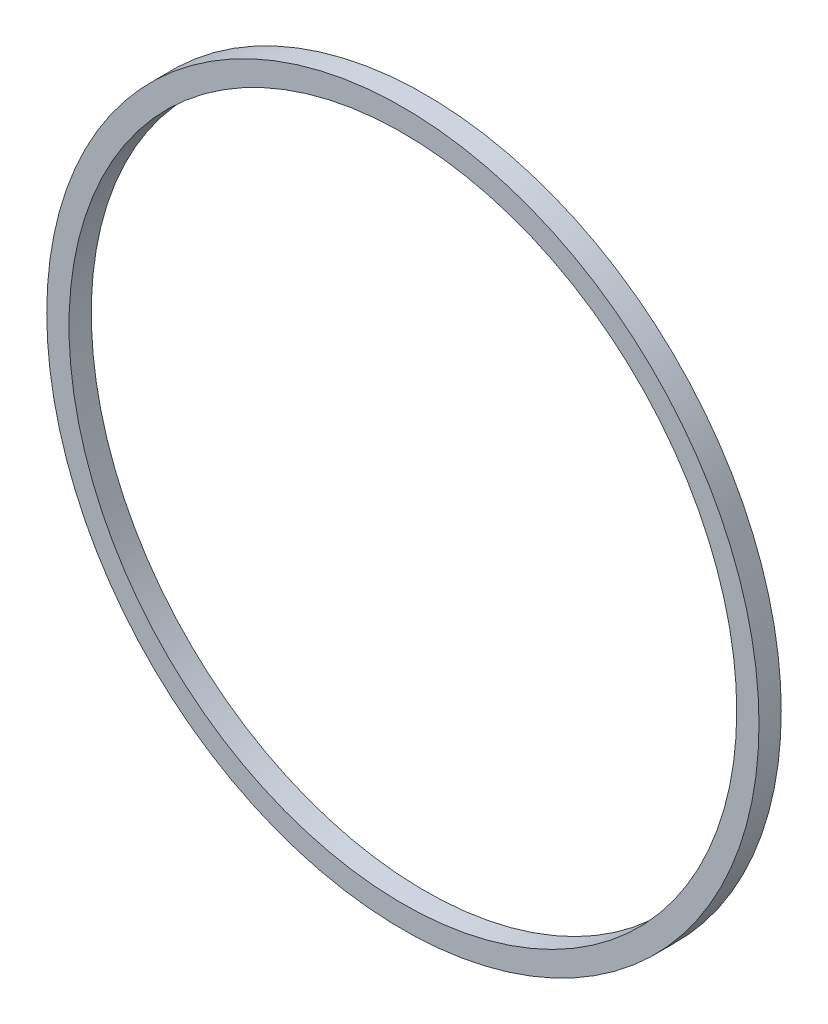
ISO-10303-21;
HEADER;
FILE_DESCRIPTION(('STEP AP214'),'2;1');
FILE_NAME('part.step','',(''),(''),'','','');
FILE_SCHEMA(('AUTOMOTIVE_DESIGN { 1 0 10303 214 1 1 1 1 }'));
ENDSEC;
DATA;
#1=APPLICATION_CONTEXT('core data for automotive mechanical design processes');
#2=APPLICATION_PROTOCOL_DEFINITION('international standard','automotive_design',2000,#1);
#3=PRODUCT_CONTEXT('',#1,'mechanical');
#4=PRODUCT('Part','Part','',(#3));
#5=PRODUCT_RELATED_PRODUCT_CATEGORY('part','',(#4));
#6=PRODUCT_DEFINITION_FORMATION('','',#4);
#7=PRODUCT_DEFINITION_CONTEXT('part definition',#1,'design');
#8=PRODUCT_DEFINITION('design','',#6,#7);
#9=PRODUCT_DEFINITION_SHAPE('','',#8);
#10=(LENGTH_UNIT() NAMED_UNIT(*) SI_UNIT(.MILLI.,.METRE.));
#11=(NAMED_UNIT(*) PLANE_ANGLE_UNIT() SI_UNIT($,.RADIAN.));
#12=(NAMED_UNIT(*) SI_UNIT($,.STERADIAN.) SOLID_ANGLE_UNIT());
#13=UNCERTAINTY_MEASURE_WITH_UNIT(LENGTH_MEASURE(1.E-05),#10,'distance_accuracy_value','');
#14=(GEOMETRIC_REPRESENTATION_CONTEXT(3) GLOBAL_UNCERTAINTY_ASSIGNED_CONTEXT((#13)) GLOBAL_UNIT_ASSIGNED_CONTEXT((#10,
#11,#12)) REPRESENTATION_CONTEXT('',''));
#15=CARTESIAN_POINT('',(0.,0.,0.));
#16=DIRECTION('',(0.,0.,1.));
#17=DIRECTION('',(1.,0.,0.));
#18=AXIS2_PLACEMENT_3D('',#15,#16,#17);
#19=CARTESIAN_POINT('',(0.,0.,1.));
#20=DIRECTION('',(0.,0.,1.));
#21=DIRECTION('',(1.,0.,0.));
#22=AXIS2_PLACEMENT_3D('',#19,#20,#21);
#23=PLANE('',#22);
#24=CARTESIAN_POINT('',(0.,0.,1.));
#25=DIRECTION('',(0.,0.,1.));
#26=DIRECTION('',(1.,0.,0.));
#27=AXIS2_PLACEMENT_3D('',#24,#25,#26);
#28=CIRCLE('',#27,16.);
#29=CARTESIAN_POINT('',(16.,0.,1.));
#30=VERTEX_POINT('',#29);
#31=EDGE_CURVE('E10',#30,#30,#28,.T.);
#32=ORIENTED_EDGE('',*,*,#31,.T.);
#33=EDGE_LOOP('',(#32));
#34=FACE_BOUND('',#33,.T.);
#35=CARTESIAN_POINT('',(0.,0.,1.));
#36=DIRECTION('',(0.,0.,1.));
#37=DIRECTION('',(1.,0.,0.));
#38=AXIS2_PLACEMENT_3D('',#35,#36,#37);
#39=CIRCLE('',#38,15.);
#40=CARTESIAN_POINT('',(15.,0.,1.));
#41=VERTEX_POINT('',#40);
#42=EDGE_CURVE('E48',#41,#41,#39,.T.);
#43=ORIENTED_EDGE('',*,*,#42,.F.);
#44=EDGE_LOOP('',(#43));
#45=FACE_BOUND('',#44,.T.);
#46=ADVANCED_FACE('F37',(#34,#45),#23,.T.);
#47=CARTESIAN_POINT('',(0.,0.,0.));
#48=DIRECTION('',(0.,0.,1.));
#49=DIRECTION('',(1.,0.,0.));
#50=AXIS2_PLACEMENT_3D('',#47,#48,#49);
#51=PLANE('',#50);
#52=CARTESIAN_POINT('',(0.,0.,0.));
#53=DIRECTION('',(0.,0.,1.));
#54=DIRECTION('',(1.,0.,0.));
#55=AXIS2_PLACEMENT_3D('',#52,#53,#54);
#56=CIRCLE('',#55,16.);
#57=CARTESIAN_POINT('',(16.,0.,0.));
#58=VERTEX_POINT('',#57);
#59=EDGE_CURVE('E41',#58,#58,#56,.T.);
#60=ORIENTED_EDGE('',*,*,#59,.F.);
#61=EDGE_LOOP('',(#60));
#62=FACE_BOUND('',#61,.T.);
#63=CARTESIAN_POINT('',(0.,0.,0.));
#64=DIRECTION('',(0.,0.,1.));
#65=DIRECTION('',(1.,0.,0.));
#66=AXIS2_PLACEMENT_3D('',#63,#64,#65);
#67=CIRCLE('',#66,15.);
#68=CARTESIAN_POINT('',(15.,0.,0.));
#69=VERTEX_POINT('',#68);
#70=EDGE_CURVE('E50',#69,#69,#67,.T.);
#71=ORIENTED_EDGE('',*,*,#70,.T.);
#72=EDGE_LOOP('',(#71));
#73=FACE_BOUND('',#72,.T.);
#74=ADVANCED_FACE('F60',(#62,#73),#51,.F.);
#75=CARTESIAN_POINT('',(0.,0.,1.));
#76=DIRECTION('',(0.,0.,-1.));
#77=DIRECTION('',(-1.,0.,0.));
#78=AXIS2_PLACEMENT_3D('',#75,#76,#77);
#79=CYLINDRICAL_SURFACE('',#78,16.);
#80=ORIENTED_EDGE('',*,*,#31,.F.);
#81=EDGE_LOOP('',(#80));
#82=FACE_BOUND('',#81,.T.);
#83=ORIENTED_EDGE('',*,*,#59,.T.);
#84=EDGE_LOOP('',(#83));
#85=FACE_BOUND('',#84,.T.);
#86=ADVANCED_FACE('F39',(#82,#85),#79,.T.);
#87=CARTESIAN_POINT('',(0.,0.,1.));
#88=DIRECTION('',(0.,0.,-1.));
#89=DIRECTION('',(-1.,0.,0.));
#90=AXIS2_PLACEMENT_3D('',#87,#88,#89);
#91=CYLINDRICAL_SURFACE('',#90,15.);
#92=ORIENTED_EDGE('',*,*,#42,.T.);
#93=EDGE_LOOP('',(#92));
#94=FACE_BOUND('',#93,.T.);
#95=ORIENTED_EDGE('',*,*,#70,.F.);
#96=EDGE_LOOP('',(#95));
#97=FACE_BOUND('',#96,.T.);
#98=ADVANCED_FACE('F56',(#94,#97),#91,.F.);
#99=CLOSED_SHELL('',(#46,#74,#86,#98));
#100=MANIFOLD_SOLID_BREP('B2',#99);
#101=ADVANCED_BREP_SHAPE_REPRESENTATION('',(#18,#100),#14);
#102=SHAPE_DEFINITION_REPRESENTATION(#9,#101);
ENDSEC;
END-ISO-10303-21;
